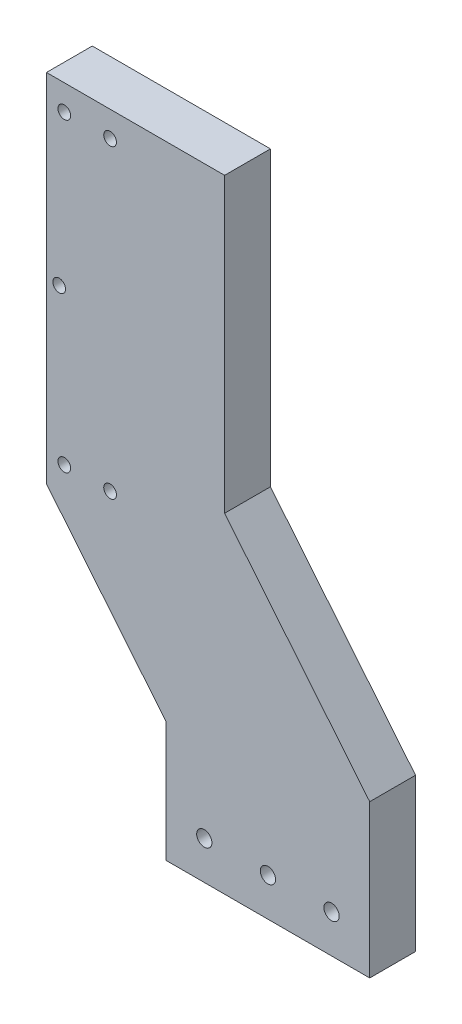
ISO-10303-21;
HEADER;
FILE_DESCRIPTION(('STEP AP214'),'2;1');
FILE_NAME('part.step','',(''),(''),'','','');
FILE_SCHEMA(('AUTOMOTIVE_DESIGN { 1 0 10303 214 1 1 1 1 }'));
ENDSEC;
DATA;
#1=APPLICATION_CONTEXT('core data for automotive mechanical design processes');
#2=APPLICATION_PROTOCOL_DEFINITION('international standard','automotive_design',2000,#1);
#3=PRODUCT_CONTEXT('',#1,'mechanical');
#4=PRODUCT('Part','Part','',(#3));
#5=PRODUCT_RELATED_PRODUCT_CATEGORY('part','',(#4));
#6=PRODUCT_DEFINITION_FORMATION('','',#4);
#7=PRODUCT_DEFINITION_CONTEXT('part definition',#1,'design');
#8=PRODUCT_DEFINITION('design','',#6,#7);
#9=PRODUCT_DEFINITION_SHAPE('','',#8);
#10=(LENGTH_UNIT() NAMED_UNIT(*) SI_UNIT(.MILLI.,.METRE.));
#11=(NAMED_UNIT(*) PLANE_ANGLE_UNIT() SI_UNIT($,.RADIAN.));
#12=(NAMED_UNIT(*) SI_UNIT($,.STERADIAN.) SOLID_ANGLE_UNIT());
#13=UNCERTAINTY_MEASURE_WITH_UNIT(LENGTH_MEASURE(1.E-05),#10,'distance_accuracy_value','');
#14=(GEOMETRIC_REPRESENTATION_CONTEXT(3) GLOBAL_UNCERTAINTY_ASSIGNED_CONTEXT((#13)) GLOBAL_UNIT_ASSIGNED_CONTEXT((#10,
#11,#12)) REPRESENTATION_CONTEXT('',''));
#15=CARTESIAN_POINT('',(0.,0.,0.));
#16=DIRECTION('',(0.,0.,1.));
#17=DIRECTION('',(1.,0.,0.));
#18=AXIS2_PLACEMENT_3D('',#15,#16,#17);
#19=CARTESIAN_POINT('',(0.,0.,18.));
#20=DIRECTION('',(-1.,0.,0.));
#21=DIRECTION('',(0.,0.,1.));
#22=AXIS2_PLACEMENT_3D('',#19,#20,#21);
#23=PLANE('',#22);
#24=DIRECTION('',(0.,1.,0.));
#25=VECTOR('',#24,1.);
#26=CARTESIAN_POINT('',(0.,0.,0.));
#27=LINE('',#26,#25);
#28=CARTESIAN_POINT('',(0.,0.,0.));
#29=VERTEX_POINT('',#28);
#30=CARTESIAN_POINT('',(0.,47.2142857142857,0.));
#31=VERTEX_POINT('',#30);
#32=EDGE_CURVE('E147',#29,#31,#27,.T.);
#33=ORIENTED_EDGE('',*,*,#32,.F.);
#34=DIRECTION('',(0.,0.,-1.));
#35=VECTOR('',#34,1.);
#36=CARTESIAN_POINT('',(0.,0.,18.));
#37=LINE('',#36,#35);
#38=CARTESIAN_POINT('',(0.,0.,18.));
#39=VERTEX_POINT('',#38);
#40=EDGE_CURVE('E11',#39,#29,#37,.T.);
#41=ORIENTED_EDGE('',*,*,#40,.F.);
#42=DIRECTION('',(0.,1.,0.));
#43=VECTOR('',#42,1.);
#44=CARTESIAN_POINT('',(0.,0.,18.));
#45=LINE('',#44,#43);
#46=CARTESIAN_POINT('',(0.,47.2142857142857,18.));
#47=VERTEX_POINT('',#46);
#48=EDGE_CURVE('E174',#39,#47,#45,.T.);
#49=ORIENTED_EDGE('',*,*,#48,.T.);
#50=DIRECTION('',(0.,0.,-1.));
#51=VECTOR('',#50,1.);
#52=CARTESIAN_POINT('',(0.,47.2142857142857,18.));
#53=LINE('',#52,#51);
#54=EDGE_CURVE('E45',#47,#31,#53,.T.);
#55=ORIENTED_EDGE('',*,*,#54,.T.);
#56=EDGE_LOOP('',(#33,#41,#49,#55));
#57=FACE_BOUND('',#56,.T.);
#58=ADVANCED_FACE('F42',(#57),#23,.T.);
#59=CARTESIAN_POINT('',(0.,0.,18.));
#60=DIRECTION('',(0.,1.,0.));
#61=DIRECTION('',(0.,0.,1.));
#62=AXIS2_PLACEMENT_3D('',#59,#60,#61);
#63=PLANE('',#62);
#64=DIRECTION('',(1.,0.,0.));
#65=VECTOR('',#64,1.);
#66=CARTESIAN_POINT('',(0.,0.,0.));
#67=LINE('',#66,#65);
#68=CARTESIAN_POINT('',(80.,0.,0.));
#69=VERTEX_POINT('',#68);
#70=EDGE_CURVE('E88',#29,#69,#67,.T.);
#71=ORIENTED_EDGE('',*,*,#70,.T.);
#72=DIRECTION('',(0.,0.,-1.));
#73=VECTOR('',#72,1.);
#74=CARTESIAN_POINT('',(80.,0.,18.));
#75=LINE('',#74,#73);
#76=CARTESIAN_POINT('',(80.,0.,18.));
#77=VERTEX_POINT('',#76);
#78=EDGE_CURVE('E52',#77,#69,#75,.T.);
#79=ORIENTED_EDGE('',*,*,#78,.F.);
#80=DIRECTION('',(1.,0.,0.));
#81=VECTOR('',#80,1.);
#82=CARTESIAN_POINT('',(0.,0.,18.));
#83=LINE('',#82,#81);
#84=EDGE_CURVE('E119',#39,#77,#83,.T.);
#85=ORIENTED_EDGE('',*,*,#84,.F.);
#86=ORIENTED_EDGE('',*,*,#40,.T.);
#87=EDGE_LOOP('',(#71,#79,#85,#86));
#88=FACE_BOUND('',#87,.T.);
#89=ADVANCED_FACE('F317',(#88),#63,.F.);
#90=CARTESIAN_POINT('',(80.,0.,18.));
#91=DIRECTION('',(-1.,0.,0.));
#92=DIRECTION('',(0.,0.,1.));
#93=AXIS2_PLACEMENT_3D('',#90,#91,#92);
#94=PLANE('',#93);
#95=DIRECTION('',(0.,1.,0.));
#96=VECTOR('',#95,1.);
#97=CARTESIAN_POINT('',(80.,0.,0.));
#98=LINE('',#97,#96);
#99=CARTESIAN_POINT('',(80.,60.,0.));
#100=VERTEX_POINT('',#99);
#101=EDGE_CURVE('E127',#69,#100,#98,.T.);
#102=ORIENTED_EDGE('',*,*,#101,.T.);
#103=DIRECTION('',(0.,0.,-1.));
#104=VECTOR('',#103,1.);
#105=CARTESIAN_POINT('',(80.,60.,18.));
#106=LINE('',#105,#104);
#107=CARTESIAN_POINT('',(80.,60.,18.));
#108=VERTEX_POINT('',#107);
#109=EDGE_CURVE('E124',#108,#100,#106,.T.);
#110=ORIENTED_EDGE('',*,*,#109,.F.);
#111=DIRECTION('',(0.,1.,0.));
#112=VECTOR('',#111,1.);
#113=CARTESIAN_POINT('',(80.,0.,18.));
#114=LINE('',#113,#112);
#115=EDGE_CURVE('E112',#77,#108,#114,.T.);
#116=ORIENTED_EDGE('',*,*,#115,.F.);
#117=ORIENTED_EDGE('',*,*,#78,.T.);
#118=EDGE_LOOP('',(#102,#110,#116,#117));
#119=FACE_BOUND('',#118,.T.);
#120=ADVANCED_FACE('F125',(#119),#94,.F.);
#121=CARTESIAN_POINT('',(80.,60.,18.));
#122=DIRECTION('',(-0.773755656108598,-0.633484162895927,0.));
#123=DIRECTION('',(0.633484162895927,-0.773755656108598,0.));
#124=AXIS2_PLACEMENT_3D('',#121,#122,#123);
#125=PLANE('',#124);
#126=DIRECTION('',(-0.633484162895927,0.773755656108598,0.));
#127=VECTOR('',#126,1.);
#128=CARTESIAN_POINT('',(80.,60.,0.));
#129=LINE('',#128,#127);
#130=CARTESIAN_POINT('',(22.9864253393666,129.638009049774,0.));
#131=VERTEX_POINT('',#130);
#132=EDGE_CURVE('E168',#100,#131,#129,.T.);
#133=ORIENTED_EDGE('',*,*,#132,.T.);
#134=DIRECTION('',(0.,0.,-1.));
#135=VECTOR('',#134,1.);
#136=CARTESIAN_POINT('',(22.9864253393666,129.638009049774,18.));
#137=LINE('',#136,#135);
#138=CARTESIAN_POINT('',(22.9864253393666,129.638009049774,18.));
#139=VERTEX_POINT('',#138);
#140=EDGE_CURVE('E131',#139,#131,#137,.T.);
#141=ORIENTED_EDGE('',*,*,#140,.F.);
#142=DIRECTION('',(-0.633484162895927,0.773755656108598,0.));
#143=VECTOR('',#142,1.);
#144=CARTESIAN_POINT('',(80.,60.,18.));
#145=LINE('',#144,#143);
#146=EDGE_CURVE('E117',#108,#139,#145,.T.);
#147=ORIENTED_EDGE('',*,*,#146,.F.);
#148=ORIENTED_EDGE('',*,*,#109,.T.);
#149=EDGE_LOOP('',(#133,#141,#147,#148));
#150=FACE_BOUND('',#149,.T.);
#151=ADVANCED_FACE('F133',(#150),#125,.F.);
#152=CARTESIAN_POINT('',(22.9864253393666,129.638009049774,18.));
#153=DIRECTION('',(-1.,0.,0.));
#154=DIRECTION('',(0.,-1.,0.));
#155=AXIS2_PLACEMENT_3D('',#152,#153,#154);
#156=PLANE('',#155);
#157=DIRECTION('',(0.,1.,0.));
#158=VECTOR('',#157,1.);
#159=CARTESIAN_POINT('',(22.9864253393666,129.638009049774,0.));
#160=LINE('',#159,#158);
#161=CARTESIAN_POINT('',(22.9864253393665,244.638009049774,0.));
#162=VERTEX_POINT('',#161);
#163=EDGE_CURVE('E164',#131,#162,#160,.T.);
#164=ORIENTED_EDGE('',*,*,#163,.T.);
#165=DIRECTION('',(0.,0.,-1.));
#166=VECTOR('',#165,1.);
#167=CARTESIAN_POINT('',(22.9864253393665,244.638009049774,18.));
#168=LINE('',#167,#166);
#169=CARTESIAN_POINT('',(22.9864253393665,244.638009049774,18.));
#170=VERTEX_POINT('',#169);
#171=EDGE_CURVE('E180',#170,#162,#168,.T.);
#172=ORIENTED_EDGE('',*,*,#171,.F.);
#173=DIRECTION('',(0.,1.,0.));
#174=VECTOR('',#173,1.);
#175=CARTESIAN_POINT('',(22.9864253393666,129.638009049774,18.));
#176=LINE('',#175,#174);
#177=EDGE_CURVE('E137',#139,#170,#176,.T.);
#178=ORIENTED_EDGE('',*,*,#177,.F.);
#179=ORIENTED_EDGE('',*,*,#140,.T.);
#180=EDGE_LOOP('',(#164,#172,#178,#179));
#181=FACE_BOUND('',#180,.T.);
#182=ADVANCED_FACE('F196',(#181),#156,.F.);
#183=CARTESIAN_POINT('',(-47.0135746606335,244.638009049774,18.));
#184=DIRECTION('',(0.,1.,0.));
#185=DIRECTION('',(0.,0.,1.));
#186=AXIS2_PLACEMENT_3D('',#183,#184,#185);
#187=PLANE('',#186);
#188=DIRECTION('',(1.,0.,0.));
#189=VECTOR('',#188,1.);
#190=CARTESIAN_POINT('',(-47.0135746606335,244.638009049774,0.));
#191=LINE('',#190,#189);
#192=CARTESIAN_POINT('',(-47.0135746606335,244.638009049774,0.));
#193=VERTEX_POINT('',#192);
#194=EDGE_CURVE('E160',#193,#162,#191,.T.);
#195=ORIENTED_EDGE('',*,*,#194,.F.);
#196=DIRECTION('',(0.,0.,-1.));
#197=VECTOR('',#196,1.);
#198=CARTESIAN_POINT('',(-47.0135746606335,244.638009049774,18.));
#199=LINE('',#198,#197);
#200=CARTESIAN_POINT('',(-47.0135746606335,244.638009049774,18.));
#201=VERTEX_POINT('',#200);
#202=EDGE_CURVE('E183',#201,#193,#199,.T.);
#203=ORIENTED_EDGE('',*,*,#202,.F.);
#204=DIRECTION('',(1.,0.,0.));
#205=VECTOR('',#204,1.);
#206=CARTESIAN_POINT('',(-47.0135746606335,244.638009049774,18.));
#207=LINE('',#206,#205);
#208=EDGE_CURVE('E141',#201,#170,#207,.T.);
#209=ORIENTED_EDGE('',*,*,#208,.T.);
#210=ORIENTED_EDGE('',*,*,#171,.T.);
#211=EDGE_LOOP('',(#195,#203,#209,#210));
#212=FACE_BOUND('',#211,.T.);
#213=ADVANCED_FACE('F331',(#212),#187,.T.);
#214=CARTESIAN_POINT('',(-47.0135746606335,104.638009049774,18.));
#215=DIRECTION('',(-1.,0.,0.));
#216=DIRECTION('',(0.,0.,1.));
#217=AXIS2_PLACEMENT_3D('',#214,#215,#216);
#218=PLANE('',#217);
#219=DIRECTION('',(0.,1.,0.));
#220=VECTOR('',#219,1.);
#221=CARTESIAN_POINT('',(-47.0135746606335,104.638009049774,0.));
#222=LINE('',#221,#220);
#223=CARTESIAN_POINT('',(-47.0135746606335,104.638009049774,0.));
#224=VERTEX_POINT('',#223);
#225=EDGE_CURVE('E156',#224,#193,#222,.T.);
#226=ORIENTED_EDGE('',*,*,#225,.F.);
#227=DIRECTION('',(0.,0.,-1.));
#228=VECTOR('',#227,1.);
#229=CARTESIAN_POINT('',(-47.0135746606335,104.638009049774,18.));
#230=LINE('',#229,#228);
#231=CARTESIAN_POINT('',(-47.0135746606335,104.638009049774,18.));
#232=VERTEX_POINT('',#231);
#233=EDGE_CURVE('E185',#232,#224,#230,.T.);
#234=ORIENTED_EDGE('',*,*,#233,.F.);
#235=DIRECTION('',(0.,1.,0.));
#236=VECTOR('',#235,1.);
#237=CARTESIAN_POINT('',(-47.0135746606335,104.638009049774,18.));
#238=LINE('',#237,#236);
#239=EDGE_CURVE('E202',#232,#201,#238,.T.);
#240=ORIENTED_EDGE('',*,*,#239,.T.);
#241=ORIENTED_EDGE('',*,*,#202,.T.);
#242=EDGE_LOOP('',(#226,#234,#240,#241));
#243=FACE_BOUND('',#242,.T.);
#244=ADVANCED_FACE('F206',(#243),#218,.T.);
#245=CARTESIAN_POINT('',(0.,47.2142857142857,18.));
#246=DIRECTION('',(-0.773755656108597,-0.633484162895927,0.));
#247=DIRECTION('',(0.633484162895927,-0.773755656108598,0.));
#248=AXIS2_PLACEMENT_3D('',#245,#246,#247);
#249=PLANE('',#248);
#250=DIRECTION('',(-0.633484162895927,0.773755656108598,0.));
#251=VECTOR('',#250,1.);
#252=CARTESIAN_POINT('',(0.,47.2142857142857,0.));
#253=LINE('',#252,#251);
#254=EDGE_CURVE('E151',#31,#224,#253,.T.);
#255=ORIENTED_EDGE('',*,*,#254,.F.);
#256=ORIENTED_EDGE('',*,*,#54,.F.);
#257=DIRECTION('',(-0.633484162895927,0.773755656108598,0.));
#258=VECTOR('',#257,1.);
#259=CARTESIAN_POINT('',(0.,47.2142857142857,18.));
#260=LINE('',#259,#258);
#261=EDGE_CURVE('E209',#47,#232,#260,.T.);
#262=ORIENTED_EDGE('',*,*,#261,.T.);
#263=ORIENTED_EDGE('',*,*,#233,.T.);
#264=EDGE_LOOP('',(#255,#256,#262,#263));
#265=FACE_BOUND('',#264,.T.);
#266=ADVANCED_FACE('F191',(#265),#249,.T.);
#267=CARTESIAN_POINT('',(0.,0.,18.));
#268=DIRECTION('',(0.,0.,-1.));
#269=DIRECTION('',(-1.,0.,0.));
#270=AXIS2_PLACEMENT_3D('',#267,#268,#269);
#271=PLANE('',#270);
#272=CARTESIAN_POINT('',(-42.0135746606335,174.638009049774,18.));
#273=DIRECTION('',(0.,0.,1.));
#274=DIRECTION('',(1.,0.,0.));
#275=AXIS2_PLACEMENT_3D('',#272,#273,#274);
#276=CIRCLE('',#275,2.49999999999999);
#277=CARTESIAN_POINT('',(-39.5135746606335,174.638009049774,18.));
#278=VERTEX_POINT('',#277);
#279=EDGE_CURVE('E276',#278,#278,#276,.T.);
#280=ORIENTED_EDGE('',*,*,#279,.F.);
#281=EDGE_LOOP('',(#280));
#282=FACE_BOUND('',#281,.T.);
#283=CARTESIAN_POINT('',(14.9999999999998,15.0000000000021,18.));
#284=DIRECTION('',(0.,0.,1.));
#285=DIRECTION('',(1.,0.,0.));
#286=AXIS2_PLACEMENT_3D('',#283,#284,#285);
#287=CIRCLE('',#286,2.9999999999996);
#288=CARTESIAN_POINT('',(17.9999999999994,15.0000000000021,18.));
#289=VERTEX_POINT('',#288);
#290=EDGE_CURVE('E266',#289,#289,#287,.T.);
#291=ORIENTED_EDGE('',*,*,#290,.F.);
#292=EDGE_LOOP('',(#291));
#293=FACE_BOUND('',#292,.T.);
#294=CARTESIAN_POINT('',(39.9999999999998,15.000000000002,18.));
#295=DIRECTION('',(0.,0.,1.));
#296=DIRECTION('',(1.,0.,0.));
#297=AXIS2_PLACEMENT_3D('',#294,#295,#296);
#298=CIRCLE('',#297,2.99999999999961);
#299=CARTESIAN_POINT('',(42.9999999999994,15.000000000002,18.));
#300=VERTEX_POINT('',#299);
#301=EDGE_CURVE('E262',#300,#300,#298,.T.);
#302=ORIENTED_EDGE('',*,*,#301,.F.);
#303=EDGE_LOOP('',(#302));
#304=FACE_BOUND('',#303,.T.);
#305=CARTESIAN_POINT('',(64.9999999999998,15.0000000000019,18.));
#306=DIRECTION('',(0.,0.,1.));
#307=DIRECTION('',(1.,0.,0.));
#308=AXIS2_PLACEMENT_3D('',#305,#306,#307);
#309=CIRCLE('',#308,2.9999999999996);
#310=CARTESIAN_POINT('',(67.9999999999994,15.0000000000019,18.));
#311=VERTEX_POINT('',#310);
#312=EDGE_CURVE('E253',#311,#311,#309,.T.);
#313=ORIENTED_EDGE('',*,*,#312,.F.);
#314=EDGE_LOOP('',(#313));
#315=FACE_BOUND('',#314,.T.);
#316=CARTESIAN_POINT('',(-40.0135746606335,114.638009049774,18.));
#317=DIRECTION('',(0.,0.,1.));
#318=DIRECTION('',(1.,0.,0.));
#319=AXIS2_PLACEMENT_3D('',#316,#317,#318);
#320=CIRCLE('',#319,2.5);
#321=CARTESIAN_POINT('',(-37.5135746606335,114.638009049774,18.));
#322=VERTEX_POINT('',#321);
#323=EDGE_CURVE('E244',#322,#322,#320,.T.);
#324=ORIENTED_EDGE('',*,*,#323,.F.);
#325=EDGE_LOOP('',(#324));
#326=FACE_BOUND('',#325,.T.);
#327=CARTESIAN_POINT('',(-22.0135746606335,114.638009049774,18.));
#328=DIRECTION('',(0.,0.,1.));
#329=DIRECTION('',(1.,0.,0.));
#330=AXIS2_PLACEMENT_3D('',#327,#328,#329);
#331=CIRCLE('',#330,2.5);
#332=CARTESIAN_POINT('',(-19.5135746606335,114.638009049774,18.));
#333=VERTEX_POINT('',#332);
#334=EDGE_CURVE('E236',#333,#333,#331,.T.);
#335=ORIENTED_EDGE('',*,*,#334,.F.);
#336=EDGE_LOOP('',(#335));
#337=FACE_BOUND('',#336,.T.);
#338=CARTESIAN_POINT('',(-40.0135746606335,234.638009049774,18.));
#339=DIRECTION('',(0.,0.,1.));
#340=DIRECTION('',(1.,0.,0.));
#341=AXIS2_PLACEMENT_3D('',#338,#339,#340);
#342=CIRCLE('',#341,2.5);
#343=CARTESIAN_POINT('',(-37.5135746606335,234.638009049774,18.));
#344=VERTEX_POINT('',#343);
#345=EDGE_CURVE('E228',#344,#344,#342,.T.);
#346=ORIENTED_EDGE('',*,*,#345,.F.);
#347=EDGE_LOOP('',(#346));
#348=FACE_BOUND('',#347,.T.);
#349=CARTESIAN_POINT('',(-22.0135746606335,234.638009049774,18.));
#350=DIRECTION('',(0.,0.,1.));
#351=DIRECTION('',(1.,0.,0.));
#352=AXIS2_PLACEMENT_3D('',#349,#350,#351);
#353=CIRCLE('',#352,2.5);
#354=CARTESIAN_POINT('',(-19.5135746606335,234.638009049774,18.));
#355=VERTEX_POINT('',#354);
#356=EDGE_CURVE('E220',#355,#355,#353,.T.);
#357=ORIENTED_EDGE('',*,*,#356,.F.);
#358=EDGE_LOOP('',(#357));
#359=FACE_BOUND('',#358,.T.);
#360=ORIENTED_EDGE('',*,*,#48,.F.);
#361=ORIENTED_EDGE('',*,*,#84,.T.);
#362=ORIENTED_EDGE('',*,*,#115,.T.);
#363=ORIENTED_EDGE('',*,*,#146,.T.);
#364=ORIENTED_EDGE('',*,*,#177,.T.);
#365=ORIENTED_EDGE('',*,*,#208,.F.);
#366=ORIENTED_EDGE('',*,*,#239,.F.);
#367=ORIENTED_EDGE('',*,*,#261,.F.);
#368=EDGE_LOOP('',(#360,#361,#362,#363,#364,#365,#366,#367));
#369=FACE_BOUND('',#368,.T.);
#370=ADVANCED_FACE('F115',(#282,#293,#304,#315,#326,#337,#348,#359,#369),#271,.F.);
#371=CARTESIAN_POINT('',(0.,0.,0.));
#372=DIRECTION('',(0.,0.,-1.));
#373=DIRECTION('',(-1.,0.,0.));
#374=AXIS2_PLACEMENT_3D('',#371,#372,#373);
#375=PLANE('',#374);
#376=CARTESIAN_POINT('',(-42.0135746606335,174.638009049774,0.));
#377=DIRECTION('',(0.,0.,1.));
#378=DIRECTION('',(1.,0.,0.));
#379=AXIS2_PLACEMENT_3D('',#376,#377,#378);
#380=CIRCLE('',#379,2.5);
#381=CARTESIAN_POINT('',(-39.5135746606335,174.638009049774,0.));
#382=VERTEX_POINT('',#381);
#383=EDGE_CURVE('E254',#382,#382,#380,.T.);
#384=ORIENTED_EDGE('',*,*,#383,.T.);
#385=EDGE_LOOP('',(#384));
#386=FACE_BOUND('',#385,.T.);
#387=CARTESIAN_POINT('',(14.9999999999998,15.0000000000021,0.));
#388=DIRECTION('',(0.,0.,1.));
#389=DIRECTION('',(1.,0.,0.));
#390=AXIS2_PLACEMENT_3D('',#387,#388,#389);
#391=CIRCLE('',#390,2.9999999999996);
#392=CARTESIAN_POINT('',(17.9999999999994,15.0000000000021,0.));
#393=VERTEX_POINT('',#392);
#394=EDGE_CURVE('E248',#393,#393,#391,.T.);
#395=ORIENTED_EDGE('',*,*,#394,.T.);
#396=EDGE_LOOP('',(#395));
#397=FACE_BOUND('',#396,.T.);
#398=CARTESIAN_POINT('',(39.9999999999998,15.000000000002,0.));
#399=DIRECTION('',(0.,0.,1.));
#400=DIRECTION('',(1.,0.,0.));
#401=AXIS2_PLACEMENT_3D('',#398,#399,#400);
#402=CIRCLE('',#401,2.99999999999961);
#403=CARTESIAN_POINT('',(42.9999999999994,15.000000000002,0.));
#404=VERTEX_POINT('',#403);
#405=EDGE_CURVE('E258',#404,#404,#402,.T.);
#406=ORIENTED_EDGE('',*,*,#405,.T.);
#407=EDGE_LOOP('',(#406));
#408=FACE_BOUND('',#407,.T.);
#409=CARTESIAN_POINT('',(64.9999999999998,15.0000000000019,0.));
#410=DIRECTION('',(0.,0.,1.));
#411=DIRECTION('',(1.,0.,0.));
#412=AXIS2_PLACEMENT_3D('',#409,#410,#411);
#413=CIRCLE('',#412,2.9999999999996);
#414=CARTESIAN_POINT('',(67.9999999999994,15.0000000000019,0.));
#415=VERTEX_POINT('',#414);
#416=EDGE_CURVE('E249',#415,#415,#413,.T.);
#417=ORIENTED_EDGE('',*,*,#416,.T.);
#418=EDGE_LOOP('',(#417));
#419=FACE_BOUND('',#418,.T.);
#420=CARTESIAN_POINT('',(-40.0135746606335,114.638009049774,0.));
#421=DIRECTION('',(0.,0.,1.));
#422=DIRECTION('',(1.,0.,0.));
#423=AXIS2_PLACEMENT_3D('',#420,#421,#422);
#424=CIRCLE('',#423,2.5);
#425=CARTESIAN_POINT('',(-37.5135746606335,114.638009049774,0.));
#426=VERTEX_POINT('',#425);
#427=EDGE_CURVE('E240',#426,#426,#424,.T.);
#428=ORIENTED_EDGE('',*,*,#427,.T.);
#429=EDGE_LOOP('',(#428));
#430=FACE_BOUND('',#429,.T.);
#431=CARTESIAN_POINT('',(-22.0135746606335,114.638009049774,0.));
#432=DIRECTION('',(0.,0.,1.));
#433=DIRECTION('',(1.,0.,0.));
#434=AXIS2_PLACEMENT_3D('',#431,#432,#433);
#435=CIRCLE('',#434,2.5);
#436=CARTESIAN_POINT('',(-19.5135746606335,114.638009049774,0.));
#437=VERTEX_POINT('',#436);
#438=EDGE_CURVE('E232',#437,#437,#435,.T.);
#439=ORIENTED_EDGE('',*,*,#438,.T.);
#440=EDGE_LOOP('',(#439));
#441=FACE_BOUND('',#440,.T.);
#442=CARTESIAN_POINT('',(-40.0135746606335,234.638009049774,0.));
#443=DIRECTION('',(0.,0.,1.));
#444=DIRECTION('',(1.,0.,0.));
#445=AXIS2_PLACEMENT_3D('',#442,#443,#444);
#446=CIRCLE('',#445,2.5);
#447=CARTESIAN_POINT('',(-37.5135746606335,234.638009049774,0.));
#448=VERTEX_POINT('',#447);
#449=EDGE_CURVE('E224',#448,#448,#446,.T.);
#450=ORIENTED_EDGE('',*,*,#449,.T.);
#451=EDGE_LOOP('',(#450));
#452=FACE_BOUND('',#451,.T.);
#453=CARTESIAN_POINT('',(-22.0135746606335,234.638009049774,0.));
#454=DIRECTION('',(0.,0.,1.));
#455=DIRECTION('',(1.,0.,0.));
#456=AXIS2_PLACEMENT_3D('',#453,#454,#455);
#457=CIRCLE('',#456,2.5);
#458=CARTESIAN_POINT('',(-19.5135746606335,234.638009049774,0.));
#459=VERTEX_POINT('',#458);
#460=EDGE_CURVE('E152',#459,#459,#457,.T.);
#461=ORIENTED_EDGE('',*,*,#460,.T.);
#462=EDGE_LOOP('',(#461));
#463=FACE_BOUND('',#462,.T.);
#464=ORIENTED_EDGE('',*,*,#32,.T.);
#465=ORIENTED_EDGE('',*,*,#254,.T.);
#466=ORIENTED_EDGE('',*,*,#225,.T.);
#467=ORIENTED_EDGE('',*,*,#194,.T.);
#468=ORIENTED_EDGE('',*,*,#163,.F.);
#469=ORIENTED_EDGE('',*,*,#132,.F.);
#470=ORIENTED_EDGE('',*,*,#101,.F.);
#471=ORIENTED_EDGE('',*,*,#70,.F.);
#472=EDGE_LOOP('',(#464,#465,#466,#467,#468,#469,#470,#471));
#473=FACE_BOUND('',#472,.T.);
#474=ADVANCED_FACE('F193',(#386,#397,#408,#419,#430,#441,#452,#463,#473),#375,.T.);
#475=CARTESIAN_POINT('',(-22.0135746606335,234.638009049774,18.));
#476=DIRECTION('',(0.,0.,1.));
#477=DIRECTION('',(1.,0.,0.));
#478=AXIS2_PLACEMENT_3D('',#475,#476,#477);
#479=CYLINDRICAL_SURFACE('',#478,2.5);
#480=ORIENTED_EDGE('',*,*,#460,.F.);
#481=EDGE_LOOP('',(#480));
#482=FACE_BOUND('',#481,.T.);
#483=ORIENTED_EDGE('',*,*,#356,.T.);
#484=EDGE_LOOP('',(#483));
#485=FACE_BOUND('',#484,.T.);
#486=ADVANCED_FACE('F301',(#482,#485),#479,.F.);
#487=CARTESIAN_POINT('',(-40.0135746606335,234.638009049774,18.));
#488=DIRECTION('',(0.,0.,1.));
#489=DIRECTION('',(1.,0.,0.));
#490=AXIS2_PLACEMENT_3D('',#487,#488,#489);
#491=CYLINDRICAL_SURFACE('',#490,2.5);
#492=ORIENTED_EDGE('',*,*,#449,.F.);
#493=EDGE_LOOP('',(#492));
#494=FACE_BOUND('',#493,.T.);
#495=ORIENTED_EDGE('',*,*,#345,.T.);
#496=EDGE_LOOP('',(#495));
#497=FACE_BOUND('',#496,.T.);
#498=ADVANCED_FACE('F303',(#494,#497),#491,.F.);
#499=CARTESIAN_POINT('',(-22.0135746606335,114.638009049774,18.));
#500=DIRECTION('',(0.,0.,1.));
#501=DIRECTION('',(1.,0.,0.));
#502=AXIS2_PLACEMENT_3D('',#499,#500,#501);
#503=CYLINDRICAL_SURFACE('',#502,2.5);
#504=ORIENTED_EDGE('',*,*,#438,.F.);
#505=EDGE_LOOP('',(#504));
#506=FACE_BOUND('',#505,.T.);
#507=ORIENTED_EDGE('',*,*,#334,.T.);
#508=EDGE_LOOP('',(#507));
#509=FACE_BOUND('',#508,.T.);
#510=ADVANCED_FACE('F310',(#506,#509),#503,.F.);
#511=CARTESIAN_POINT('',(-40.0135746606335,114.638009049774,18.));
#512=DIRECTION('',(0.,0.,1.));
#513=DIRECTION('',(1.,0.,0.));
#514=AXIS2_PLACEMENT_3D('',#511,#512,#513);
#515=CYLINDRICAL_SURFACE('',#514,2.5);
#516=ORIENTED_EDGE('',*,*,#427,.F.);
#517=EDGE_LOOP('',(#516));
#518=FACE_BOUND('',#517,.T.);
#519=ORIENTED_EDGE('',*,*,#323,.T.);
#520=EDGE_LOOP('',(#519));
#521=FACE_BOUND('',#520,.T.);
#522=ADVANCED_FACE('F384',(#518,#521),#515,.F.);
#523=CARTESIAN_POINT('',(64.9999999999998,15.0000000000019,0.));
#524=DIRECTION('',(0.,0.,1.));
#525=DIRECTION('',(1.,0.,0.));
#526=AXIS2_PLACEMENT_3D('',#523,#524,#525);
#527=CYLINDRICAL_SURFACE('',#526,2.9999999999996);
#528=ORIENTED_EDGE('',*,*,#416,.F.);
#529=EDGE_LOOP('',(#528));
#530=FACE_BOUND('',#529,.T.);
#531=ORIENTED_EDGE('',*,*,#312,.T.);
#532=EDGE_LOOP('',(#531));
#533=FACE_BOUND('',#532,.T.);
#534=ADVANCED_FACE('F393',(#530,#533),#527,.F.);
#535=CARTESIAN_POINT('',(39.9999999999998,15.000000000002,0.));
#536=DIRECTION('',(0.,0.,1.));
#537=DIRECTION('',(1.,0.,0.));
#538=AXIS2_PLACEMENT_3D('',#535,#536,#537);
#539=CYLINDRICAL_SURFACE('',#538,2.99999999999961);
#540=ORIENTED_EDGE('',*,*,#405,.F.);
#541=EDGE_LOOP('',(#540));
#542=FACE_BOUND('',#541,.T.);
#543=ORIENTED_EDGE('',*,*,#301,.T.);
#544=EDGE_LOOP('',(#543));
#545=FACE_BOUND('',#544,.T.);
#546=ADVANCED_FACE('F403',(#542,#545),#539,.F.);
#547=CARTESIAN_POINT('',(14.9999999999998,15.0000000000021,0.));
#548=DIRECTION('',(0.,0.,1.));
#549=DIRECTION('',(1.,0.,0.));
#550=AXIS2_PLACEMENT_3D('',#547,#548,#549);
#551=CYLINDRICAL_SURFACE('',#550,2.9999999999996);
#552=ORIENTED_EDGE('',*,*,#394,.F.);
#553=EDGE_LOOP('',(#552));
#554=FACE_BOUND('',#553,.T.);
#555=ORIENTED_EDGE('',*,*,#290,.T.);
#556=EDGE_LOOP('',(#555));
#557=FACE_BOUND('',#556,.T.);
#558=ADVANCED_FACE('F361',(#554,#557),#551,.F.);
#559=CARTESIAN_POINT('',(-42.0135746606335,174.638009049774,18.));
#560=DIRECTION('',(0.,0.,1.));
#561=DIRECTION('',(1.,0.,0.));
#562=AXIS2_PLACEMENT_3D('',#559,#560,#561);
#563=CYLINDRICAL_SURFACE('',#562,2.49999999999999);
#564=ORIENTED_EDGE('',*,*,#383,.F.);
#565=EDGE_LOOP('',(#564));
#566=FACE_BOUND('',#565,.T.);
#567=ORIENTED_EDGE('',*,*,#279,.T.);
#568=EDGE_LOOP('',(#567));
#569=FACE_BOUND('',#568,.T.);
#570=ADVANCED_FACE('F282',(#566,#569),#563,.F.);
#571=CLOSED_SHELL('',(#58,#89,#120,#151,#182,#213,#244,#266,#370,#474,#486,#498,#510,#522,#534,
#546,#558,#570));
#572=MANIFOLD_SOLID_BREP('B2',#571);
#573=ADVANCED_BREP_SHAPE_REPRESENTATION('',(#18,#572),#14);
#574=SHAPE_DEFINITION_REPRESENTATION(#9,#573);
ENDSEC;
END-ISO-10303-21;
